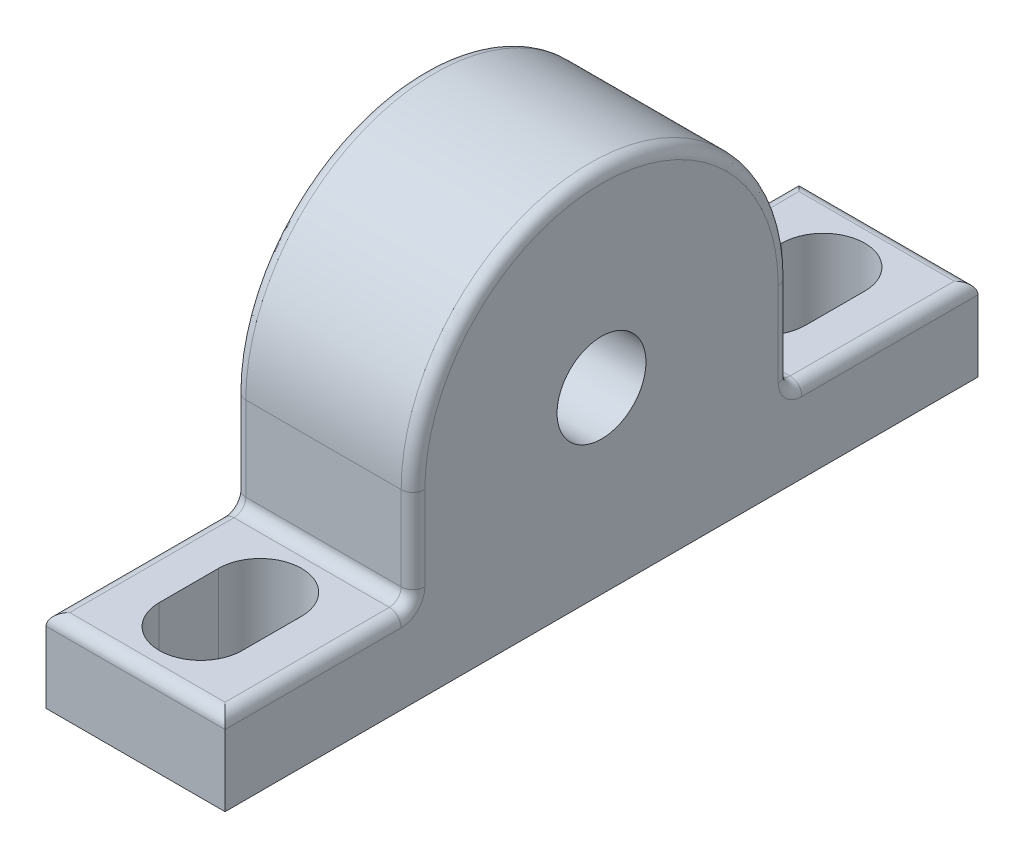
ISO-10303-21;
HEADER;
FILE_DESCRIPTION(('STEP AP214'),'2;1');
FILE_NAME('part.step','',(''),(''),'','','');
FILE_SCHEMA(('AUTOMOTIVE_DESIGN { 1 0 10303 214 1 1 1 1 }'));
ENDSEC;
DATA;
#1=APPLICATION_CONTEXT('core data for automotive mechanical design processes');
#2=APPLICATION_PROTOCOL_DEFINITION('international standard','automotive_design',2000,#1);
#3=PRODUCT_CONTEXT('',#1,'mechanical');
#4=PRODUCT('Part','Part','',(#3));
#5=PRODUCT_RELATED_PRODUCT_CATEGORY('part','',(#4));
#6=PRODUCT_DEFINITION_FORMATION('','',#4);
#7=PRODUCT_DEFINITION_CONTEXT('part definition',#1,'design');
#8=PRODUCT_DEFINITION('design','',#6,#7);
#9=PRODUCT_DEFINITION_SHAPE('','',#8);
#10=(LENGTH_UNIT() NAMED_UNIT(*) SI_UNIT(.MILLI.,.METRE.));
#11=(NAMED_UNIT(*) PLANE_ANGLE_UNIT() SI_UNIT($,.RADIAN.));
#12=(NAMED_UNIT(*) SI_UNIT($,.STERADIAN.) SOLID_ANGLE_UNIT());
#13=UNCERTAINTY_MEASURE_WITH_UNIT(LENGTH_MEASURE(1.E-05),#10,'distance_accuracy_value','');
#14=(GEOMETRIC_REPRESENTATION_CONTEXT(3) GLOBAL_UNCERTAINTY_ASSIGNED_CONTEXT((#13)) GLOBAL_UNIT_ASSIGNED_CONTEXT((#10,
#11,#12)) REPRESENTATION_CONTEXT('',''));
#15=CARTESIAN_POINT('',(0.,0.,0.));
#16=DIRECTION('',(0.,0.,1.));
#17=DIRECTION('',(1.,0.,0.));
#18=AXIS2_PLACEMENT_3D('',#15,#16,#17);
#19=CARTESIAN_POINT('',(30.2,0.,63.5));
#20=DIRECTION('',(0.,0.,-1.));
#21=DIRECTION('',(-1.,0.,0.));
#22=AXIS2_PLACEMENT_3D('',#19,#20,#21);
#23=PLANE('',#22);
#24=DIRECTION('',(0.,-1.,0.));
#25=VECTOR('',#24,1.);
#26=CARTESIAN_POINT('',(30.2,0.,63.5));
#27=LINE('',#26,#25);
#28=CARTESIAN_POINT('',(30.2,12.,63.5));
#29=VERTEX_POINT('',#28);
#30=CARTESIAN_POINT('',(30.2,0.,63.5));
#31=VERTEX_POINT('',#30);
#32=EDGE_CURVE('E292',#29,#31,#27,.T.);
#33=ORIENTED_EDGE('',*,*,#32,.F.);
#34=DIRECTION('',(-1.,0.,0.));
#35=VECTOR('',#34,1.);
#36=CARTESIAN_POINT('',(30.2,12.,63.5));
#37=LINE('',#36,#35);
#38=CARTESIAN_POINT('',(0.,12.,63.5));
#39=VERTEX_POINT('',#38);
#40=EDGE_CURVE('E49',#29,#39,#37,.T.);
#41=ORIENTED_EDGE('',*,*,#40,.T.);
#42=DIRECTION('',(0.,-1.,0.));
#43=VECTOR('',#42,1.);
#44=CARTESIAN_POINT('',(0.,0.,63.5));
#45=LINE('',#44,#43);
#46=CARTESIAN_POINT('',(0.,0.,63.5));
#47=VERTEX_POINT('',#46);
#48=EDGE_CURVE('E288',#39,#47,#45,.T.);
#49=ORIENTED_EDGE('',*,*,#48,.T.);
#50=DIRECTION('',(-1.,0.,0.));
#51=VECTOR('',#50,1.);
#52=CARTESIAN_POINT('',(30.2,0.,63.5));
#53=LINE('',#52,#51);
#54=EDGE_CURVE('E314',#31,#47,#53,.T.);
#55=ORIENTED_EDGE('',*,*,#54,.F.);
#56=EDGE_LOOP('',(#33,#41,#49,#55));
#57=FACE_BOUND('',#56,.T.);
#58=ADVANCED_FACE('F40',(#57),#23,.F.);
#59=CARTESIAN_POINT('',(30.2,0.,63.5));
#60=DIRECTION('',(0.,1.,0.));
#61=DIRECTION('',(0.,0.,1.));
#62=AXIS2_PLACEMENT_3D('',#59,#60,#61);
#63=PLANE('',#62);
#64=DIRECTION('',(0.,0.,-1.));
#65=VECTOR('',#64,1.);
#66=CARTESIAN_POINT('',(8.1,0.,52.5));
#67=LINE('',#66,#65);
#68=CARTESIAN_POINT('',(8.1,0.,52.5));
#69=VERTEX_POINT('',#68);
#70=CARTESIAN_POINT('',(8.1,0.,42.5));
#71=VERTEX_POINT('',#70);
#72=EDGE_CURVE('E238',#69,#71,#67,.T.);
#73=ORIENTED_EDGE('',*,*,#72,.F.);
#74=CARTESIAN_POINT('',(15.1,0.,52.5));
#75=DIRECTION('',(0.,1.,0.));
#76=DIRECTION('',(0.,0.,1.));
#77=AXIS2_PLACEMENT_3D('',#74,#75,#76);
#78=CIRCLE('',#77,7.);
#79=CARTESIAN_POINT('',(22.1,0.,52.5));
#80=VERTEX_POINT('',#79);
#81=EDGE_CURVE('E218',#80,#69,#78,.F.);
#82=ORIENTED_EDGE('',*,*,#81,.F.);
#83=DIRECTION('',(0.,0.,1.));
#84=VECTOR('',#83,1.);
#85=CARTESIAN_POINT('',(22.1,0.,52.5));
#86=LINE('',#85,#84);
#87=CARTESIAN_POINT('',(22.1,0.,42.5));
#88=VERTEX_POINT('',#87);
#89=EDGE_CURVE('E229',#88,#80,#86,.T.);
#90=ORIENTED_EDGE('',*,*,#89,.F.);
#91=CARTESIAN_POINT('',(15.1,0.,42.5));
#92=DIRECTION('',(0.,1.,0.));
#93=DIRECTION('',(0.,0.,1.));
#94=AXIS2_PLACEMENT_3D('',#91,#92,#93);
#95=CIRCLE('',#94,7.);
#96=EDGE_CURVE('E57',#71,#88,#95,.F.);
#97=ORIENTED_EDGE('',*,*,#96,.F.);
#98=EDGE_LOOP('',(#73,#82,#90,#97));
#99=FACE_BOUND('',#98,.T.);
#100=DIRECTION('',(0.,0.,-1.));
#101=VECTOR('',#100,1.);
#102=CARTESIAN_POINT('',(8.1,0.,-42.5));
#103=LINE('',#102,#101);
#104=CARTESIAN_POINT('',(8.1,0.,-42.5));
#105=VERTEX_POINT('',#104);
#106=CARTESIAN_POINT('',(8.1,0.,-52.5));
#107=VERTEX_POINT('',#106);
#108=EDGE_CURVE('E256',#105,#107,#103,.T.);
#109=ORIENTED_EDGE('',*,*,#108,.F.);
#110=CARTESIAN_POINT('',(15.1,0.,-42.5));
#111=DIRECTION('',(0.,1.,0.));
#112=DIRECTION('',(0.,0.,1.));
#113=AXIS2_PLACEMENT_3D('',#110,#111,#112);
#114=CIRCLE('',#113,7.);
#115=CARTESIAN_POINT('',(22.1,0.,-42.5));
#116=VERTEX_POINT('',#115);
#117=EDGE_CURVE('E259',#116,#105,#114,.F.);
#118=ORIENTED_EDGE('',*,*,#117,.F.);
#119=DIRECTION('',(0.,0.,1.));
#120=VECTOR('',#119,1.);
#121=CARTESIAN_POINT('',(22.1,0.,-42.5));
#122=LINE('',#121,#120);
#123=CARTESIAN_POINT('',(22.1,0.,-52.5));
#124=VERTEX_POINT('',#123);
#125=EDGE_CURVE('E276',#124,#116,#122,.T.);
#126=ORIENTED_EDGE('',*,*,#125,.F.);
#127=CARTESIAN_POINT('',(15.1,0.,-52.5));
#128=DIRECTION('',(0.,1.,0.));
#129=DIRECTION('',(0.,0.,1.));
#130=AXIS2_PLACEMENT_3D('',#127,#128,#129);
#131=CIRCLE('',#130,7.);
#132=EDGE_CURVE('E65',#107,#124,#131,.F.);
#133=ORIENTED_EDGE('',*,*,#132,.F.);
#134=EDGE_LOOP('',(#109,#118,#126,#133));
#135=FACE_BOUND('',#134,.T.);
#136=DIRECTION('',(0.,0.,-1.));
#137=VECTOR('',#136,1.);
#138=CARTESIAN_POINT('',(0.,0.,63.5));
#139=LINE('',#138,#137);
#140=CARTESIAN_POINT('',(0.,0.,-63.5));
#141=VERTEX_POINT('',#140);
#142=EDGE_CURVE('E302',#47,#141,#139,.T.);
#143=ORIENTED_EDGE('',*,*,#142,.T.);
#144=DIRECTION('',(-1.,0.,0.));
#145=VECTOR('',#144,1.);
#146=CARTESIAN_POINT('',(30.2,0.,-63.5));
#147=LINE('',#146,#145);
#148=CARTESIAN_POINT('',(30.2,0.,-63.5));
#149=VERTEX_POINT('',#148);
#150=EDGE_CURVE('E311',#149,#141,#147,.T.);
#151=ORIENTED_EDGE('',*,*,#150,.F.);
#152=DIRECTION('',(0.,0.,-1.));
#153=VECTOR('',#152,1.);
#154=CARTESIAN_POINT('',(30.2,0.,63.5));
#155=LINE('',#154,#153);
#156=EDGE_CURVE('E294',#31,#149,#155,.T.);
#157=ORIENTED_EDGE('',*,*,#156,.F.);
#158=ORIENTED_EDGE('',*,*,#54,.T.);
#159=EDGE_LOOP('',(#143,#151,#157,#158));
#160=FACE_BOUND('',#159,.T.);
#161=ADVANCED_FACE('F235',(#99,#135,#160),#63,.F.);
#162=CARTESIAN_POINT('',(30.2,0.,-63.5));
#163=DIRECTION('',(0.,0.,1.));
#164=DIRECTION('',(1.,0.,0.));
#165=AXIS2_PLACEMENT_3D('',#162,#163,#164);
#166=PLANE('',#165);
#167=DIRECTION('',(0.,1.,0.));
#168=VECTOR('',#167,1.);
#169=CARTESIAN_POINT('',(0.,0.,-63.5));
#170=LINE('',#169,#168);
#171=CARTESIAN_POINT('',(0.,12.,-63.5));
#172=VERTEX_POINT('',#171);
#173=EDGE_CURVE('E295',#141,#172,#170,.T.);
#174=ORIENTED_EDGE('',*,*,#173,.T.);
#175=DIRECTION('',(-1.,0.,0.));
#176=VECTOR('',#175,1.);
#177=CARTESIAN_POINT('',(30.2,12.,-63.5));
#178=LINE('',#177,#176);
#179=CARTESIAN_POINT('',(30.2,12.,-63.5));
#180=VERTEX_POINT('',#179);
#181=EDGE_CURVE('E11',#172,#180,#178,.F.);
#182=ORIENTED_EDGE('',*,*,#181,.T.);
#183=DIRECTION('',(0.,1.,0.));
#184=VECTOR('',#183,1.);
#185=CARTESIAN_POINT('',(30.2,0.,-63.5));
#186=LINE('',#185,#184);
#187=EDGE_CURVE('E297',#149,#180,#186,.T.);
#188=ORIENTED_EDGE('',*,*,#187,.F.);
#189=ORIENTED_EDGE('',*,*,#150,.T.);
#190=EDGE_LOOP('',(#174,#182,#188,#189));
#191=FACE_BOUND('',#190,.T.);
#192=ADVANCED_FACE('F466',(#191),#166,.F.);
#193=CARTESIAN_POINT('',(30.2,14.,-31.8));
#194=DIRECTION('',(0.,-1.,0.));
#195=DIRECTION('',(0.,0.,-1.));
#196=AXIS2_PLACEMENT_3D('',#193,#194,#195);
#197=PLANE('',#196);
#198=DIRECTION('',(0.,0.,-1.));
#199=VECTOR('',#198,1.);
#200=CARTESIAN_POINT('',(22.1,14.,-42.5));
#201=LINE('',#200,#199);
#202=CARTESIAN_POINT('',(22.1,14.,-42.5));
#203=VERTEX_POINT('',#202);
#204=CARTESIAN_POINT('',(22.1,14.,-52.5));
#205=VERTEX_POINT('',#204);
#206=EDGE_CURVE('E264',#203,#205,#201,.T.);
#207=ORIENTED_EDGE('',*,*,#206,.F.);
#208=CARTESIAN_POINT('',(15.1,14.,-42.5));
#209=DIRECTION('',(0.,1.,0.));
#210=DIRECTION('',(0.,0.,1.));
#211=AXIS2_PLACEMENT_3D('',#208,#209,#210);
#212=CIRCLE('',#211,7.);
#213=CARTESIAN_POINT('',(8.1,14.,-42.5));
#214=VERTEX_POINT('',#213);
#215=EDGE_CURVE('E262',#214,#203,#212,.T.);
#216=ORIENTED_EDGE('',*,*,#215,.F.);
#217=DIRECTION('',(0.,0.,1.));
#218=VECTOR('',#217,1.);
#219=CARTESIAN_POINT('',(8.1,14.,-42.5));
#220=LINE('',#219,#218);
#221=CARTESIAN_POINT('',(8.1,14.,-52.5));
#222=VERTEX_POINT('',#221);
#223=EDGE_CURVE('E270',#222,#214,#220,.T.);
#224=ORIENTED_EDGE('',*,*,#223,.F.);
#225=CARTESIAN_POINT('',(15.1,14.,-52.5));
#226=DIRECTION('',(0.,1.,0.));
#227=DIRECTION('',(0.,0.,1.));
#228=AXIS2_PLACEMENT_3D('',#225,#226,#227);
#229=CIRCLE('',#228,7.);
#230=EDGE_CURVE('E267',#205,#222,#229,.T.);
#231=ORIENTED_EDGE('',*,*,#230,.F.);
#232=EDGE_LOOP('',(#207,#216,#224,#231));
#233=FACE_BOUND('',#232,.T.);
#234=DIRECTION('',(0.,0.,1.));
#235=VECTOR('',#234,1.);
#236=CARTESIAN_POINT('',(28.2,14.,-63.5));
#237=LINE('',#236,#235);
#238=CARTESIAN_POINT('',(28.2,14.,-33.8));
#239=VERTEX_POINT('',#238);
#240=CARTESIAN_POINT('',(28.2,14.,-61.5));
#241=VERTEX_POINT('',#240);
#242=EDGE_CURVE('E338',#239,#241,#237,.F.);
#243=ORIENTED_EDGE('',*,*,#242,.T.);
#244=DIRECTION('',(-1.,0.,0.));
#245=VECTOR('',#244,1.);
#246=CARTESIAN_POINT('',(30.2,14.,-61.5));
#247=LINE('',#246,#245);
#248=CARTESIAN_POINT('',(2.,14.,-61.5));
#249=VERTEX_POINT('',#248);
#250=EDGE_CURVE('E341',#241,#249,#247,.T.);
#251=ORIENTED_EDGE('',*,*,#250,.T.);
#252=DIRECTION('',(0.,0.,1.));
#253=VECTOR('',#252,1.);
#254=CARTESIAN_POINT('',(2.,14.,-31.8));
#255=LINE('',#254,#253);
#256=CARTESIAN_POINT('',(2.,14.,-33.8));
#257=VERTEX_POINT('',#256);
#258=EDGE_CURVE('E336',#249,#257,#255,.T.);
#259=ORIENTED_EDGE('',*,*,#258,.T.);
#260=DIRECTION('',(-1.,0.,0.));
#261=VECTOR('',#260,1.);
#262=CARTESIAN_POINT('',(30.2,14.,-33.8));
#263=LINE('',#262,#261);
#264=EDGE_CURVE('E334',#257,#239,#263,.F.);
#265=ORIENTED_EDGE('',*,*,#264,.T.);
#266=EDGE_LOOP('',(#243,#251,#259,#265));
#267=FACE_BOUND('',#266,.T.);
#268=ADVANCED_FACE('F535',(#233,#267),#197,.F.);
#269=CARTESIAN_POINT('',(30.2,30.2,-31.8));
#270=DIRECTION('',(0.,0.,1.));
#271=DIRECTION('',(1.,0.,0.));
#272=AXIS2_PLACEMENT_3D('',#269,#270,#271);
#273=PLANE('',#272);
#274=DIRECTION('',(-1.,0.,0.));
#275=VECTOR('',#274,1.);
#276=CARTESIAN_POINT('',(30.2,30.2,-31.8));
#277=LINE('',#276,#275);
#278=CARTESIAN_POINT('',(28.2,30.2,-31.8));
#279=VERTEX_POINT('',#278);
#280=CARTESIAN_POINT('',(2.,30.2,-31.8));
#281=VERTEX_POINT('',#280);
#282=EDGE_CURVE('E308',#279,#281,#277,.T.);
#283=ORIENTED_EDGE('',*,*,#282,.F.);
#284=DIRECTION('',(0.,1.,0.));
#285=VECTOR('',#284,1.);
#286=CARTESIAN_POINT('',(28.2,14.,-31.8));
#287=LINE('',#286,#285);
#288=CARTESIAN_POINT('',(28.2,16.,-31.8));
#289=VERTEX_POINT('',#288);
#290=EDGE_CURVE('E363',#279,#289,#287,.F.);
#291=ORIENTED_EDGE('',*,*,#290,.T.);
#292=DIRECTION('',(-1.,0.,0.));
#293=VECTOR('',#292,1.);
#294=CARTESIAN_POINT('',(0.,16.,-31.8));
#295=LINE('',#294,#293);
#296=CARTESIAN_POINT('',(2.,16.,-31.8));
#297=VERTEX_POINT('',#296);
#298=EDGE_CURVE('E359',#289,#297,#295,.T.);
#299=ORIENTED_EDGE('',*,*,#298,.T.);
#300=DIRECTION('',(0.,1.,0.));
#301=VECTOR('',#300,1.);
#302=CARTESIAN_POINT('',(2.,30.2,-31.8));
#303=LINE('',#302,#301);
#304=EDGE_CURVE('E361',#297,#281,#303,.T.);
#305=ORIENTED_EDGE('',*,*,#304,.T.);
#306=EDGE_LOOP('',(#283,#291,#299,#305));
#307=FACE_BOUND('',#306,.T.);
#308=ADVANCED_FACE('F542',(#307),#273,.F.);
#309=CARTESIAN_POINT('',(30.2,30.2,0.));
#310=DIRECTION('',(-1.,0.,0.));
#311=DIRECTION('',(0.,0.,1.));
#312=AXIS2_PLACEMENT_3D('',#309,#310,#311);
#313=CYLINDRICAL_SURFACE('',#312,31.8);
#314=DIRECTION('',(-1.,0.,0.));
#315=VECTOR('',#314,1.);
#316=CARTESIAN_POINT('',(30.2,30.1999999999998,31.8));
#317=LINE('',#316,#315);
#318=CARTESIAN_POINT('',(28.2,30.1999999999998,31.8));
#319=VERTEX_POINT('',#318);
#320=CARTESIAN_POINT('',(2.,30.1999999999998,31.8));
#321=VERTEX_POINT('',#320);
#322=EDGE_CURVE('E300',#319,#321,#317,.T.);
#323=ORIENTED_EDGE('',*,*,#322,.F.);
#324=CARTESIAN_POINT('',(28.2,30.2,0.));
#325=DIRECTION('',(1.,0.,0.));
#326=DIRECTION('',(0.,0.,-1.));
#327=AXIS2_PLACEMENT_3D('',#324,#325,#326);
#328=CIRCLE('',#327,31.8);
#329=EDGE_CURVE('E368',#319,#279,#328,.F.);
#330=ORIENTED_EDGE('',*,*,#329,.T.);
#331=ORIENTED_EDGE('',*,*,#282,.T.);
#332=CARTESIAN_POINT('',(2.,30.2,0.));
#333=DIRECTION('',(1.,0.,0.));
#334=DIRECTION('',(0.,0.,-1.));
#335=AXIS2_PLACEMENT_3D('',#332,#333,#334);
#336=CIRCLE('',#335,31.8);
#337=EDGE_CURVE('E366',#281,#321,#336,.T.);
#338=ORIENTED_EDGE('',*,*,#337,.T.);
#339=EDGE_LOOP('',(#323,#330,#331,#338));
#340=FACE_BOUND('',#339,.T.);
#341=ADVANCED_FACE('F545',(#340),#313,.T.);
#342=CARTESIAN_POINT('',(30.2,30.1999999999998,31.8));
#343=DIRECTION('',(0.,0.,-1.));
#344=DIRECTION('',(-1.,0.,0.));
#345=AXIS2_PLACEMENT_3D('',#342,#343,#344);
#346=PLANE('',#345);
#347=DIRECTION('',(-1.,0.,0.));
#348=VECTOR('',#347,1.);
#349=CARTESIAN_POINT('',(30.2,16.,31.8));
#350=LINE('',#349,#348);
#351=CARTESIAN_POINT('',(2.,16.,31.8));
#352=VERTEX_POINT('',#351);
#353=CARTESIAN_POINT('',(28.2,16.,31.8));
#354=VERTEX_POINT('',#353);
#355=EDGE_CURVE('E370',#352,#354,#350,.F.);
#356=ORIENTED_EDGE('',*,*,#355,.T.);
#357=DIRECTION('',(0.,-1.,0.));
#358=VECTOR('',#357,1.);
#359=CARTESIAN_POINT('',(28.2,30.1999999999998,31.8));
#360=LINE('',#359,#358);
#361=EDGE_CURVE('E374',#354,#319,#360,.F.);
#362=ORIENTED_EDGE('',*,*,#361,.T.);
#363=ORIENTED_EDGE('',*,*,#322,.T.);
#364=DIRECTION('',(0.,-1.,0.));
#365=VECTOR('',#364,1.);
#366=CARTESIAN_POINT('',(2.,30.1999999999998,31.8));
#367=LINE('',#366,#365);
#368=EDGE_CURVE('E372',#321,#352,#367,.T.);
#369=ORIENTED_EDGE('',*,*,#368,.T.);
#370=EDGE_LOOP('',(#356,#362,#363,#369));
#371=FACE_BOUND('',#370,.T.);
#372=ADVANCED_FACE('F547',(#371),#346,.F.);
#373=CARTESIAN_POINT('',(30.2,14.,63.5));
#374=DIRECTION('',(0.,-1.,0.));
#375=DIRECTION('',(0.,0.,-1.));
#376=AXIS2_PLACEMENT_3D('',#373,#374,#375);
#377=PLANE('',#376);
#378=DIRECTION('',(0.,0.,-1.));
#379=VECTOR('',#378,1.);
#380=CARTESIAN_POINT('',(22.1,14.,52.5));
#381=LINE('',#380,#379);
#382=CARTESIAN_POINT('',(22.1,14.,52.5));
#383=VERTEX_POINT('',#382);
#384=CARTESIAN_POINT('',(22.1,14.,42.5));
#385=VERTEX_POINT('',#384);
#386=EDGE_CURVE('E240',#383,#385,#381,.T.);
#387=ORIENTED_EDGE('',*,*,#386,.F.);
#388=CARTESIAN_POINT('',(15.1,14.,52.5));
#389=DIRECTION('',(0.,1.,0.));
#390=DIRECTION('',(0.,0.,1.));
#391=AXIS2_PLACEMENT_3D('',#388,#389,#390);
#392=CIRCLE('',#391,7.);
#393=CARTESIAN_POINT('',(8.1,14.,52.5));
#394=VERTEX_POINT('',#393);
#395=EDGE_CURVE('E221',#394,#383,#392,.T.);
#396=ORIENTED_EDGE('',*,*,#395,.F.);
#397=DIRECTION('',(0.,0.,1.));
#398=VECTOR('',#397,1.);
#399=CARTESIAN_POINT('',(8.1,14.,52.5));
#400=LINE('',#399,#398);
#401=CARTESIAN_POINT('',(8.1,14.,42.5));
#402=VERTEX_POINT('',#401);
#403=EDGE_CURVE('E226',#402,#394,#400,.T.);
#404=ORIENTED_EDGE('',*,*,#403,.F.);
#405=CARTESIAN_POINT('',(15.1,14.,42.5));
#406=DIRECTION('',(0.,1.,0.));
#407=DIRECTION('',(0.,0.,1.));
#408=AXIS2_PLACEMENT_3D('',#405,#406,#407);
#409=CIRCLE('',#408,7.);
#410=EDGE_CURVE('E246',#385,#402,#409,.T.);
#411=ORIENTED_EDGE('',*,*,#410,.F.);
#412=EDGE_LOOP('',(#387,#396,#404,#411));
#413=FACE_BOUND('',#412,.T.);
#414=DIRECTION('',(0.,0.,1.));
#415=VECTOR('',#414,1.);
#416=CARTESIAN_POINT('',(28.2,14.,31.8));
#417=LINE('',#416,#415);
#418=CARTESIAN_POINT('',(28.2,14.,61.5));
#419=VERTEX_POINT('',#418);
#420=CARTESIAN_POINT('',(28.2,14.,33.8));
#421=VERTEX_POINT('',#420);
#422=EDGE_CURVE('E380',#419,#421,#417,.F.);
#423=ORIENTED_EDGE('',*,*,#422,.T.);
#424=DIRECTION('',(-1.,0.,0.));
#425=VECTOR('',#424,1.);
#426=CARTESIAN_POINT('',(0.,14.,33.8));
#427=LINE('',#426,#425);
#428=CARTESIAN_POINT('',(2.,14.,33.8));
#429=VERTEX_POINT('',#428);
#430=EDGE_CURVE('E382',#421,#429,#427,.T.);
#431=ORIENTED_EDGE('',*,*,#430,.T.);
#432=DIRECTION('',(0.,0.,1.));
#433=VECTOR('',#432,1.);
#434=CARTESIAN_POINT('',(2.,14.,63.5));
#435=LINE('',#434,#433);
#436=CARTESIAN_POINT('',(2.,14.,61.5));
#437=VERTEX_POINT('',#436);
#438=EDGE_CURVE('E376',#429,#437,#435,.T.);
#439=ORIENTED_EDGE('',*,*,#438,.T.);
#440=DIRECTION('',(-1.,0.,0.));
#441=VECTOR('',#440,1.);
#442=CARTESIAN_POINT('',(30.2,14.,61.5));
#443=LINE('',#442,#441);
#444=EDGE_CURVE('E378',#437,#419,#443,.F.);
#445=ORIENTED_EDGE('',*,*,#444,.T.);
#446=EDGE_LOOP('',(#423,#431,#439,#445));
#447=FACE_BOUND('',#446,.T.);
#448=ADVANCED_FACE('F505',(#413,#447),#377,.F.);
#449=CARTESIAN_POINT('',(30.2,30.2,0.));
#450=DIRECTION('',(1.,0.,0.));
#451=DIRECTION('',(0.,0.,-1.));
#452=AXIS2_PLACEMENT_3D('',#449,#450,#451);
#453=PLANE('',#452);
#454=CARTESIAN_POINT('',(30.2,30.2,0.));
#455=DIRECTION('',(1.,0.,0.));
#456=DIRECTION('',(0.,0.,-1.));
#457=AXIS2_PLACEMENT_3D('',#454,#455,#456);
#458=CIRCLE('',#457,7.5);
#459=CARTESIAN_POINT('',(30.2,30.2,-7.5));
#460=VERTEX_POINT('',#459);
#461=EDGE_CURVE('E289',#460,#460,#458,.T.);
#462=ORIENTED_EDGE('',*,*,#461,.F.);
#463=EDGE_LOOP('',(#462));
#464=FACE_BOUND('',#463,.T.);
#465=ORIENTED_EDGE('',*,*,#187,.T.);
#466=DIRECTION('',(0.,0.,1.));
#467=VECTOR('',#466,1.);
#468=CARTESIAN_POINT('',(30.2,12.,-31.8));
#469=LINE('',#468,#467);
#470=CARTESIAN_POINT('',(30.2,12.,-33.8));
#471=VERTEX_POINT('',#470);
#472=EDGE_CURVE('E331',#180,#471,#469,.T.);
#473=ORIENTED_EDGE('',*,*,#472,.T.);
#474=CARTESIAN_POINT('',(30.2,16.,-33.8));
#475=DIRECTION('',(1.,0.,0.));
#476=DIRECTION('',(0.,0.,-1.));
#477=AXIS2_PLACEMENT_3D('',#474,#475,#476);
#478=CIRCLE('',#477,4.);
#479=CARTESIAN_POINT('',(30.2,16.,-29.8));
#480=VERTEX_POINT('',#479);
#481=EDGE_CURVE('E328',#480,#471,#478,.T.);
#482=ORIENTED_EDGE('',*,*,#481,.F.);
#483=DIRECTION('',(0.,1.,0.));
#484=VECTOR('',#483,1.);
#485=CARTESIAN_POINT('',(30.2,30.2,-29.8));
#486=LINE('',#485,#484);
#487=CARTESIAN_POINT('',(30.2,30.2,-29.8));
#488=VERTEX_POINT('',#487);
#489=EDGE_CURVE('E326',#480,#488,#486,.T.);
#490=ORIENTED_EDGE('',*,*,#489,.T.);
#491=CARTESIAN_POINT('',(30.2,30.2,0.));
#492=DIRECTION('',(1.,0.,0.));
#493=DIRECTION('',(0.,0.,-1.));
#494=AXIS2_PLACEMENT_3D('',#491,#492,#493);
#495=CIRCLE('',#494,29.8);
#496=CARTESIAN_POINT('',(30.2,30.1999999999998,29.8));
#497=VERTEX_POINT('',#496);
#498=EDGE_CURVE('E324',#488,#497,#495,.T.);
#499=ORIENTED_EDGE('',*,*,#498,.T.);
#500=DIRECTION('',(0.,-1.,0.));
#501=VECTOR('',#500,1.);
#502=CARTESIAN_POINT('',(30.2,14.,29.8));
#503=LINE('',#502,#501);
#504=CARTESIAN_POINT('',(30.2,16.,29.8));
#505=VERTEX_POINT('',#504);
#506=EDGE_CURVE('E322',#497,#505,#503,.T.);
#507=ORIENTED_EDGE('',*,*,#506,.T.);
#508=CARTESIAN_POINT('',(30.2,16.,33.8));
#509=DIRECTION('',(1.,0.,0.));
#510=DIRECTION('',(0.,0.,-1.));
#511=AXIS2_PLACEMENT_3D('',#508,#509,#510);
#512=CIRCLE('',#511,4.);
#513=CARTESIAN_POINT('',(30.2,12.,33.8));
#514=VERTEX_POINT('',#513);
#515=EDGE_CURVE('E319',#514,#505,#512,.T.);
#516=ORIENTED_EDGE('',*,*,#515,.F.);
#517=DIRECTION('',(0.,0.,1.));
#518=VECTOR('',#517,1.);
#519=CARTESIAN_POINT('',(30.2,12.,63.5));
#520=LINE('',#519,#518);
#521=EDGE_CURVE('E317',#514,#29,#520,.T.);
#522=ORIENTED_EDGE('',*,*,#521,.T.);
#523=ORIENTED_EDGE('',*,*,#32,.T.);
#524=ORIENTED_EDGE('',*,*,#156,.T.);
#525=EDGE_LOOP('',(#465,#473,#482,#490,#499,#507,#516,#522,#523,#524));
#526=FACE_BOUND('',#525,.T.);
#527=ADVANCED_FACE('F460',(#464,#526),#453,.T.);
#528=CARTESIAN_POINT('',(0.,30.2,0.));
#529=DIRECTION('',(1.,0.,0.));
#530=DIRECTION('',(0.,0.,-1.));
#531=AXIS2_PLACEMENT_3D('',#528,#529,#530);
#532=PLANE('',#531);
#533=CARTESIAN_POINT('',(0.,30.2,0.));
#534=DIRECTION('',(1.,0.,0.));
#535=DIRECTION('',(0.,0.,-1.));
#536=AXIS2_PLACEMENT_3D('',#533,#534,#535);
#537=CIRCLE('',#536,7.5);
#538=CARTESIAN_POINT('',(0.,30.2,-7.5));
#539=VERTEX_POINT('',#538);
#540=EDGE_CURVE('E285',#539,#539,#537,.T.);
#541=ORIENTED_EDGE('',*,*,#540,.T.);
#542=EDGE_LOOP('',(#541));
#543=FACE_BOUND('',#542,.T.);
#544=CARTESIAN_POINT('',(0.,16.,-33.8));
#545=DIRECTION('',(1.,0.,0.));
#546=DIRECTION('',(0.,0.,-1.));
#547=AXIS2_PLACEMENT_3D('',#544,#545,#546);
#548=CIRCLE('',#547,4.);
#549=CARTESIAN_POINT('',(0.,12.,-33.8));
#550=VERTEX_POINT('',#549);
#551=CARTESIAN_POINT('',(0.,16.,-29.8));
#552=VERTEX_POINT('',#551);
#553=EDGE_CURVE('E354',#550,#552,#548,.F.);
#554=ORIENTED_EDGE('',*,*,#553,.F.);
#555=DIRECTION('',(0.,0.,1.));
#556=VECTOR('',#555,1.);
#557=CARTESIAN_POINT('',(0.,12.,0.));
#558=LINE('',#557,#556);
#559=EDGE_CURVE('E357',#550,#172,#558,.F.);
#560=ORIENTED_EDGE('',*,*,#559,.T.);
#561=ORIENTED_EDGE('',*,*,#173,.F.);
#562=ORIENTED_EDGE('',*,*,#142,.F.);
#563=ORIENTED_EDGE('',*,*,#48,.F.);
#564=DIRECTION('',(0.,0.,1.));
#565=VECTOR('',#564,1.);
#566=CARTESIAN_POINT('',(0.,12.,0.));
#567=LINE('',#566,#565);
#568=CARTESIAN_POINT('',(0.,12.,33.8));
#569=VERTEX_POINT('',#568);
#570=EDGE_CURVE('E346',#39,#569,#567,.F.);
#571=ORIENTED_EDGE('',*,*,#570,.T.);
#572=CARTESIAN_POINT('',(0.,16.,33.8));
#573=DIRECTION('',(1.,0.,0.));
#574=DIRECTION('',(0.,0.,-1.));
#575=AXIS2_PLACEMENT_3D('',#572,#573,#574);
#576=CIRCLE('',#575,4.);
#577=CARTESIAN_POINT('',(0.,16.,29.8));
#578=VERTEX_POINT('',#577);
#579=EDGE_CURVE('E343',#578,#569,#576,.F.);
#580=ORIENTED_EDGE('',*,*,#579,.F.);
#581=DIRECTION('',(0.,-1.,0.));
#582=VECTOR('',#581,1.);
#583=CARTESIAN_POINT('',(0.,30.2,29.8));
#584=LINE('',#583,#582);
#585=CARTESIAN_POINT('',(0.,30.1999999999998,29.8));
#586=VERTEX_POINT('',#585);
#587=EDGE_CURVE('E348',#578,#586,#584,.F.);
#588=ORIENTED_EDGE('',*,*,#587,.T.);
#589=CARTESIAN_POINT('',(0.,30.2,0.));
#590=DIRECTION('',(1.,0.,0.));
#591=DIRECTION('',(0.,0.,-1.));
#592=AXIS2_PLACEMENT_3D('',#589,#590,#591);
#593=CIRCLE('',#592,29.8);
#594=CARTESIAN_POINT('',(0.,30.2,-29.8));
#595=VERTEX_POINT('',#594);
#596=EDGE_CURVE('E350',#586,#595,#593,.F.);
#597=ORIENTED_EDGE('',*,*,#596,.T.);
#598=DIRECTION('',(0.,1.,0.));
#599=VECTOR('',#598,1.);
#600=CARTESIAN_POINT('',(0.,30.2,-29.8));
#601=LINE('',#600,#599);
#602=EDGE_CURVE('E352',#595,#552,#601,.F.);
#603=ORIENTED_EDGE('',*,*,#602,.T.);
#604=EDGE_LOOP('',(#554,#560,#561,#562,#563,#571,#580,#588,#597,#603));
#605=FACE_BOUND('',#604,.T.);
#606=ADVANCED_FACE('F451',(#543,#605),#532,.F.);
#607=CARTESIAN_POINT('',(0.,30.2,0.));
#608=DIRECTION('',(1.,0.,0.));
#609=DIRECTION('',(0.,0.,-1.));
#610=AXIS2_PLACEMENT_3D('',#607,#608,#609);
#611=CYLINDRICAL_SURFACE('',#610,7.5);
#612=ORIENTED_EDGE('',*,*,#540,.F.);
#613=EDGE_LOOP('',(#612));
#614=FACE_BOUND('',#613,.T.);
#615=ORIENTED_EDGE('',*,*,#461,.T.);
#616=EDGE_LOOP('',(#615));
#617=FACE_BOUND('',#616,.T.);
#618=ADVANCED_FACE('F600',(#614,#617),#611,.F.);
#619=CARTESIAN_POINT('',(2.,12.,63.5));
#620=DIRECTION('',(0.,0.,1.));
#621=DIRECTION('',(0.,-1.,0.));
#622=AXIS2_PLACEMENT_3D('',#619,#620,#621);
#623=CYLINDRICAL_SURFACE('',#622,2.);
#624=CARTESIAN_POINT('',(2.,12.,33.8));
#625=DIRECTION('',(0.,0.,-1.));
#626=DIRECTION('',(-1.,0.,0.));
#627=AXIS2_PLACEMENT_3D('',#624,#625,#626);
#628=CIRCLE('',#627,2.);
#629=EDGE_CURVE('E434',#569,#429,#628,.T.);
#630=ORIENTED_EDGE('',*,*,#629,.F.);
#631=ORIENTED_EDGE('',*,*,#570,.F.);
#632=CARTESIAN_POINT('',(2.,12.,61.5));
#633=DIRECTION('',(0.707106781186547,0.,0.707106781186547));
#634=DIRECTION('',(-0.707106781186547,0.,0.707106781186547));
#635=AXIS2_PLACEMENT_3D('',#632,#633,#634);
#636=ELLIPSE('',#635,2.82842712474619,2.);
#637=EDGE_CURVE('E44',#437,#39,#636,.T.);
#638=ORIENTED_EDGE('',*,*,#637,.F.);
#639=ORIENTED_EDGE('',*,*,#438,.F.);
#640=EDGE_LOOP('',(#630,#631,#638,#639));
#641=FACE_BOUND('',#640,.T.);
#642=ADVANCED_FACE('F42',(#641),#623,.T.);
#643=CARTESIAN_POINT('',(30.2,12.,61.5));
#644=DIRECTION('',(-1.,0.,0.));
#645=DIRECTION('',(0.,0.,1.));
#646=AXIS2_PLACEMENT_3D('',#643,#644,#645);
#647=CYLINDRICAL_SURFACE('',#646,2.);
#648=ORIENTED_EDGE('',*,*,#637,.T.);
#649=ORIENTED_EDGE('',*,*,#40,.F.);
#650=CARTESIAN_POINT('',(28.2,12.,61.5));
#651=DIRECTION('',(-0.707106781186547,0.,0.707106781186547));
#652=DIRECTION('',(-0.707106781186547,0.,-0.707106781186547));
#653=AXIS2_PLACEMENT_3D('',#650,#651,#652);
#654=ELLIPSE('',#653,2.82842712474619,2.);
#655=EDGE_CURVE('E432',#419,#29,#654,.F.);
#656=ORIENTED_EDGE('',*,*,#655,.F.);
#657=ORIENTED_EDGE('',*,*,#444,.F.);
#658=EDGE_LOOP('',(#648,#649,#656,#657));
#659=FACE_BOUND('',#658,.T.);
#660=ADVANCED_FACE('F445',(#659),#647,.T.);
#661=CARTESIAN_POINT('',(2.,16.,33.8));
#662=DIRECTION('',(1.,0.,0.));
#663=DIRECTION('',(0.,0.,-1.));
#664=AXIS2_PLACEMENT_3D('',#661,#662,#663);
#665=TOROIDAL_SURFACE('',#664,4.,2.);
#666=ORIENTED_EDGE('',*,*,#579,.T.);
#667=ORIENTED_EDGE('',*,*,#629,.T.);
#668=CARTESIAN_POINT('',(2.,16.,33.8));
#669=DIRECTION('',(1.,0.,0.));
#670=DIRECTION('',(0.,0.,-1.));
#671=AXIS2_PLACEMENT_3D('',#668,#669,#670);
#672=CIRCLE('',#671,2.);
#673=EDGE_CURVE('E430',#352,#429,#672,.F.);
#674=ORIENTED_EDGE('',*,*,#673,.F.);
#675=CARTESIAN_POINT('',(2.,16.,29.8));
#676=DIRECTION('',(0.,-1.,0.));
#677=DIRECTION('',(0.,0.,-1.));
#678=AXIS2_PLACEMENT_3D('',#675,#676,#677);
#679=CIRCLE('',#678,2.);
#680=EDGE_CURVE('E427',#578,#352,#679,.F.);
#681=ORIENTED_EDGE('',*,*,#680,.F.);
#682=EDGE_LOOP('',(#666,#667,#674,#681));
#683=FACE_BOUND('',#682,.T.);
#684=ADVANCED_FACE('F509',(#683),#665,.T.);
#685=CARTESIAN_POINT('',(28.2,12.,0.));
#686=DIRECTION('',(0.,0.,-1.));
#687=DIRECTION('',(0.,1.,0.));
#688=AXIS2_PLACEMENT_3D('',#685,#686,#687);
#689=CYLINDRICAL_SURFACE('',#688,2.);
#690=ORIENTED_EDGE('',*,*,#655,.T.);
#691=ORIENTED_EDGE('',*,*,#521,.F.);
#692=CARTESIAN_POINT('',(28.2,12.,33.8));
#693=DIRECTION('',(0.,0.,-1.));
#694=DIRECTION('',(-1.,0.,0.));
#695=AXIS2_PLACEMENT_3D('',#692,#693,#694);
#696=CIRCLE('',#695,2.);
#697=EDGE_CURVE('E424',#421,#514,#696,.T.);
#698=ORIENTED_EDGE('',*,*,#697,.F.);
#699=ORIENTED_EDGE('',*,*,#422,.F.);
#700=EDGE_LOOP('',(#690,#691,#698,#699));
#701=FACE_BOUND('',#700,.T.);
#702=ADVANCED_FACE('F501',(#701),#689,.T.);
#703=CARTESIAN_POINT('',(30.2,16.,33.8));
#704=DIRECTION('',(1.,0.,0.));
#705=DIRECTION('',(0.,0.,-1.));
#706=AXIS2_PLACEMENT_3D('',#703,#704,#705);
#707=CYLINDRICAL_SURFACE('',#706,2.);
#708=ORIENTED_EDGE('',*,*,#673,.T.);
#709=ORIENTED_EDGE('',*,*,#430,.F.);
#710=CARTESIAN_POINT('',(28.2,16.,33.8));
#711=DIRECTION('',(1.,0.,0.));
#712=DIRECTION('',(0.,0.,-1.));
#713=AXIS2_PLACEMENT_3D('',#710,#711,#712);
#714=CIRCLE('',#713,2.);
#715=EDGE_CURVE('E421',#354,#421,#714,.F.);
#716=ORIENTED_EDGE('',*,*,#715,.F.);
#717=ORIENTED_EDGE('',*,*,#355,.F.);
#718=EDGE_LOOP('',(#708,#709,#716,#717));
#719=FACE_BOUND('',#718,.T.);
#720=ADVANCED_FACE('F507',(#719),#707,.F.);
#721=CARTESIAN_POINT('',(2.,30.1999999999998,29.8));
#722=DIRECTION('',(0.,-1.,0.));
#723=DIRECTION('',(0.,0.,-1.));
#724=AXIS2_PLACEMENT_3D('',#721,#722,#723);
#725=CYLINDRICAL_SURFACE('',#724,2.);
#726=ORIENTED_EDGE('',*,*,#680,.T.);
#727=ORIENTED_EDGE('',*,*,#368,.F.);
#728=CARTESIAN_POINT('',(2.,30.1999999999998,29.8));
#729=DIRECTION('',(0.,1.,0.));
#730=DIRECTION('',(0.,0.,1.));
#731=AXIS2_PLACEMENT_3D('',#728,#729,#730);
#732=CIRCLE('',#731,2.);
#733=EDGE_CURVE('E418',#586,#321,#732,.T.);
#734=ORIENTED_EDGE('',*,*,#733,.F.);
#735=ORIENTED_EDGE('',*,*,#587,.F.);
#736=EDGE_LOOP('',(#726,#727,#734,#735));
#737=FACE_BOUND('',#736,.T.);
#738=ADVANCED_FACE('F514',(#737),#725,.T.);
#739=CARTESIAN_POINT('',(28.2,16.,33.8));
#740=DIRECTION('',(1.,0.,0.));
#741=DIRECTION('',(0.,0.,-1.));
#742=AXIS2_PLACEMENT_3D('',#739,#740,#741);
#743=TOROIDAL_SURFACE('',#742,4.,2.);
#744=ORIENTED_EDGE('',*,*,#697,.T.);
#745=ORIENTED_EDGE('',*,*,#515,.T.);
#746=CARTESIAN_POINT('',(28.2,16.,29.8));
#747=DIRECTION('',(0.,-1.,0.));
#748=DIRECTION('',(0.,0.,-1.));
#749=AXIS2_PLACEMENT_3D('',#746,#747,#748);
#750=CIRCLE('',#749,2.);
#751=EDGE_CURVE('E415',#354,#505,#750,.F.);
#752=ORIENTED_EDGE('',*,*,#751,.F.);
#753=ORIENTED_EDGE('',*,*,#715,.T.);
#754=EDGE_LOOP('',(#744,#745,#752,#753));
#755=FACE_BOUND('',#754,.T.);
#756=ADVANCED_FACE('F497',(#755),#743,.T.);
#757=CARTESIAN_POINT('',(2.,30.2,0.));
#758=DIRECTION('',(1.,0.,0.));
#759=DIRECTION('',(0.,0.,-1.));
#760=AXIS2_PLACEMENT_3D('',#757,#758,#759);
#761=TOROIDAL_SURFACE('',#760,29.8,2.);
#762=ORIENTED_EDGE('',*,*,#733,.T.);
#763=ORIENTED_EDGE('',*,*,#337,.F.);
#764=CARTESIAN_POINT('',(2.,30.2,-29.8));
#765=DIRECTION('',(0.,-1.,0.));
#766=DIRECTION('',(0.,0.,-1.));
#767=AXIS2_PLACEMENT_3D('',#764,#765,#766);
#768=CIRCLE('',#767,2.);
#769=EDGE_CURVE('E412',#595,#281,#768,.T.);
#770=ORIENTED_EDGE('',*,*,#769,.F.);
#771=ORIENTED_EDGE('',*,*,#596,.F.);
#772=EDGE_LOOP('',(#762,#763,#770,#771));
#773=FACE_BOUND('',#772,.T.);
#774=ADVANCED_FACE('F521',(#773),#761,.T.);
#775=CARTESIAN_POINT('',(28.2,30.2,29.8));
#776=DIRECTION('',(0.,1.,0.));
#777=DIRECTION('',(0.,0.,1.));
#778=AXIS2_PLACEMENT_3D('',#775,#776,#777);
#779=CYLINDRICAL_SURFACE('',#778,2.);
#780=ORIENTED_EDGE('',*,*,#751,.T.);
#781=ORIENTED_EDGE('',*,*,#506,.F.);
#782=CARTESIAN_POINT('',(28.2,30.1999999999998,29.8));
#783=DIRECTION('',(0.,1.,0.));
#784=DIRECTION('',(-1.,0.,0.));
#785=AXIS2_PLACEMENT_3D('',#782,#783,#784);
#786=CIRCLE('',#785,2.);
#787=EDGE_CURVE('E409',#319,#497,#786,.T.);
#788=ORIENTED_EDGE('',*,*,#787,.F.);
#789=ORIENTED_EDGE('',*,*,#361,.F.);
#790=EDGE_LOOP('',(#780,#781,#788,#789));
#791=FACE_BOUND('',#790,.T.);
#792=ADVANCED_FACE('F493',(#791),#779,.T.);
#793=CARTESIAN_POINT('',(2.,30.2,-29.8));
#794=DIRECTION('',(0.,1.,0.));
#795=DIRECTION('',(0.,0.,1.));
#796=AXIS2_PLACEMENT_3D('',#793,#794,#795);
#797=CYLINDRICAL_SURFACE('',#796,2.);
#798=ORIENTED_EDGE('',*,*,#769,.T.);
#799=ORIENTED_EDGE('',*,*,#304,.F.);
#800=CARTESIAN_POINT('',(2.,16.,-29.8));
#801=DIRECTION('',(0.,-1.,0.));
#802=DIRECTION('',(0.,0.,-1.));
#803=AXIS2_PLACEMENT_3D('',#800,#801,#802);
#804=CIRCLE('',#803,2.);
#805=EDGE_CURVE('E406',#552,#297,#804,.T.);
#806=ORIENTED_EDGE('',*,*,#805,.F.);
#807=ORIENTED_EDGE('',*,*,#602,.F.);
#808=EDGE_LOOP('',(#798,#799,#806,#807));
#809=FACE_BOUND('',#808,.T.);
#810=ADVANCED_FACE('F524',(#809),#797,.T.);
#811=CARTESIAN_POINT('',(28.2,30.2,0.));
#812=DIRECTION('',(1.,0.,0.));
#813=DIRECTION('',(0.,0.,-1.));
#814=AXIS2_PLACEMENT_3D('',#811,#812,#813);
#815=TOROIDAL_SURFACE('',#814,29.8,2.);
#816=ORIENTED_EDGE('',*,*,#787,.T.);
#817=ORIENTED_EDGE('',*,*,#498,.F.);
#818=CARTESIAN_POINT('',(28.2,30.2,-29.8));
#819=DIRECTION('',(0.,-1.,0.));
#820=DIRECTION('',(0.,0.,-1.));
#821=AXIS2_PLACEMENT_3D('',#818,#819,#820);
#822=CIRCLE('',#821,2.);
#823=EDGE_CURVE('E400',#279,#488,#822,.T.);
#824=ORIENTED_EDGE('',*,*,#823,.F.);
#825=ORIENTED_EDGE('',*,*,#329,.F.);
#826=EDGE_LOOP('',(#816,#817,#824,#825));
#827=FACE_BOUND('',#826,.T.);
#828=ADVANCED_FACE('F489',(#827),#815,.T.);
#829=CARTESIAN_POINT('',(2.,16.,-33.8));
#830=DIRECTION('',(1.,0.,0.));
#831=DIRECTION('',(0.,0.,-1.));
#832=AXIS2_PLACEMENT_3D('',#829,#830,#831);
#833=TOROIDAL_SURFACE('',#832,4.,2.);
#834=CARTESIAN_POINT('',(2.,16.,-33.8));
#835=DIRECTION('',(1.,0.,0.));
#836=DIRECTION('',(0.,0.,-1.));
#837=AXIS2_PLACEMENT_3D('',#834,#835,#836);
#838=CIRCLE('',#837,2.);
#839=EDGE_CURVE('E397',#257,#297,#838,.F.);
#840=ORIENTED_EDGE('',*,*,#839,.F.);
#841=CARTESIAN_POINT('',(2.,12.,-33.8));
#842=DIRECTION('',(0.,0.,1.));
#843=DIRECTION('',(1.,0.,0.));
#844=AXIS2_PLACEMENT_3D('',#841,#842,#843);
#845=CIRCLE('',#844,2.);
#846=EDGE_CURVE('E403',#550,#257,#845,.F.);
#847=ORIENTED_EDGE('',*,*,#846,.F.);
#848=ORIENTED_EDGE('',*,*,#553,.T.);
#849=ORIENTED_EDGE('',*,*,#805,.T.);
#850=EDGE_LOOP('',(#840,#847,#848,#849));
#851=FACE_BOUND('',#850,.T.);
#852=ADVANCED_FACE('F528',(#851),#833,.T.);
#853=CARTESIAN_POINT('',(2.,12.,-31.8));
#854=DIRECTION('',(0.,0.,1.));
#855=DIRECTION('',(0.,-1.,0.));
#856=AXIS2_PLACEMENT_3D('',#853,#854,#855);
#857=CYLINDRICAL_SURFACE('',#856,2.);
#858=ORIENTED_EDGE('',*,*,#846,.T.);
#859=ORIENTED_EDGE('',*,*,#258,.F.);
#860=CARTESIAN_POINT('',(2.,12.,-61.5));
#861=DIRECTION('',(-0.707106781186547,0.,0.707106781186547));
#862=DIRECTION('',(-0.707106781186547,0.,-0.707106781186547));
#863=AXIS2_PLACEMENT_3D('',#860,#861,#862);
#864=ELLIPSE('',#863,2.82842712474619,2.);
#865=EDGE_CURVE('E394',#172,#249,#864,.F.);
#866=ORIENTED_EDGE('',*,*,#865,.F.);
#867=ORIENTED_EDGE('',*,*,#559,.F.);
#868=EDGE_LOOP('',(#858,#859,#866,#867));
#869=FACE_BOUND('',#868,.T.);
#870=ADVANCED_FACE('F533',(#869),#857,.T.);
#871=CARTESIAN_POINT('',(28.2,30.2,-29.8));
#872=DIRECTION('',(0.,-1.,0.));
#873=DIRECTION('',(0.,0.,-1.));
#874=AXIS2_PLACEMENT_3D('',#871,#872,#873);
#875=CYLINDRICAL_SURFACE('',#874,2.);
#876=ORIENTED_EDGE('',*,*,#823,.T.);
#877=ORIENTED_EDGE('',*,*,#489,.F.);
#878=CARTESIAN_POINT('',(28.2,16.,-29.8));
#879=DIRECTION('',(0.,-1.,0.));
#880=DIRECTION('',(0.,0.,-1.));
#881=AXIS2_PLACEMENT_3D('',#878,#879,#880);
#882=CIRCLE('',#881,2.);
#883=EDGE_CURVE('E391',#289,#480,#882,.T.);
#884=ORIENTED_EDGE('',*,*,#883,.F.);
#885=ORIENTED_EDGE('',*,*,#290,.F.);
#886=EDGE_LOOP('',(#876,#877,#884,#885));
#887=FACE_BOUND('',#886,.T.);
#888=ADVANCED_FACE('F483',(#887),#875,.T.);
#889=CARTESIAN_POINT('',(30.2,16.,-33.8));
#890=DIRECTION('',(1.,0.,0.));
#891=DIRECTION('',(0.,0.,-1.));
#892=AXIS2_PLACEMENT_3D('',#889,#890,#891);
#893=CYLINDRICAL_SURFACE('',#892,2.);
#894=ORIENTED_EDGE('',*,*,#839,.T.);
#895=ORIENTED_EDGE('',*,*,#298,.F.);
#896=CARTESIAN_POINT('',(28.2,16.,-33.8));
#897=DIRECTION('',(1.,0.,0.));
#898=DIRECTION('',(0.,0.,-1.));
#899=AXIS2_PLACEMENT_3D('',#896,#897,#898);
#900=CIRCLE('',#899,2.);
#901=EDGE_CURVE('E389',#239,#289,#900,.F.);
#902=ORIENTED_EDGE('',*,*,#901,.F.);
#903=ORIENTED_EDGE('',*,*,#264,.F.);
#904=EDGE_LOOP('',(#894,#895,#902,#903));
#905=FACE_BOUND('',#904,.T.);
#906=ADVANCED_FACE('F539',(#905),#893,.F.);
#907=CARTESIAN_POINT('',(30.2,12.,-61.5));
#908=DIRECTION('',(-1.,0.,0.));
#909=DIRECTION('',(0.,0.,1.));
#910=AXIS2_PLACEMENT_3D('',#907,#908,#909);
#911=CYLINDRICAL_SURFACE('',#910,2.);
#912=ORIENTED_EDGE('',*,*,#865,.T.);
#913=ORIENTED_EDGE('',*,*,#250,.F.);
#914=CARTESIAN_POINT('',(28.2,12.,-61.5));
#915=DIRECTION('',(-0.707106781186547,0.,-0.707106781186547));
#916=DIRECTION('',(-0.707106781186547,0.,0.707106781186547));
#917=AXIS2_PLACEMENT_3D('',#914,#915,#916);
#918=ELLIPSE('',#917,2.82842712474619,2.);
#919=EDGE_CURVE('E387',#180,#241,#918,.F.);
#920=ORIENTED_EDGE('',*,*,#919,.F.);
#921=ORIENTED_EDGE('',*,*,#181,.F.);
#922=EDGE_LOOP('',(#912,#913,#920,#921));
#923=FACE_BOUND('',#922,.T.);
#924=ADVANCED_FACE('F472',(#923),#911,.T.);
#925=CARTESIAN_POINT('',(28.2,16.,-33.8));
#926=DIRECTION('',(1.,0.,0.));
#927=DIRECTION('',(0.,0.,-1.));
#928=AXIS2_PLACEMENT_3D('',#925,#926,#927);
#929=TOROIDAL_SURFACE('',#928,4.,2.);
#930=ORIENTED_EDGE('',*,*,#883,.T.);
#931=ORIENTED_EDGE('',*,*,#481,.T.);
#932=CARTESIAN_POINT('',(28.2,12.,-33.8));
#933=DIRECTION('',(0.,0.,1.));
#934=DIRECTION('',(1.,0.,0.));
#935=AXIS2_PLACEMENT_3D('',#932,#933,#934);
#936=CIRCLE('',#935,2.);
#937=EDGE_CURVE('E232',#239,#471,#936,.F.);
#938=ORIENTED_EDGE('',*,*,#937,.F.);
#939=ORIENTED_EDGE('',*,*,#901,.T.);
#940=EDGE_LOOP('',(#930,#931,#938,#939));
#941=FACE_BOUND('',#940,.T.);
#942=ADVANCED_FACE('F478',(#941),#929,.T.);
#943=CARTESIAN_POINT('',(28.2,12.,0.));
#944=DIRECTION('',(0.,0.,-1.));
#945=DIRECTION('',(0.,1.,0.));
#946=AXIS2_PLACEMENT_3D('',#943,#944,#945);
#947=CYLINDRICAL_SURFACE('',#946,2.);
#948=ORIENTED_EDGE('',*,*,#919,.T.);
#949=ORIENTED_EDGE('',*,*,#242,.F.);
#950=ORIENTED_EDGE('',*,*,#937,.T.);
#951=ORIENTED_EDGE('',*,*,#472,.F.);
#952=EDGE_LOOP('',(#948,#949,#950,#951));
#953=FACE_BOUND('',#952,.T.);
#954=ADVANCED_FACE('F475',(#953),#947,.T.);
#955=CARTESIAN_POINT('',(15.1,-0.000999999999999265,52.5));
#956=DIRECTION('',(0.,1.,0.));
#957=DIRECTION('',(0.,0.,1.));
#958=AXIS2_PLACEMENT_3D('',#955,#956,#957);
#959=CYLINDRICAL_SURFACE('',#958,7.);
#960=ORIENTED_EDGE('',*,*,#81,.T.);
#961=DIRECTION('',(0.,1.,0.));
#962=VECTOR('',#961,1.);
#963=CARTESIAN_POINT('',(8.1,-0.000999999999999265,52.5));
#964=LINE('',#963,#962);
#965=EDGE_CURVE('E233',#69,#394,#964,.T.);
#966=ORIENTED_EDGE('',*,*,#965,.T.);
#967=ORIENTED_EDGE('',*,*,#395,.T.);
#968=DIRECTION('',(0.,1.,0.));
#969=VECTOR('',#968,1.);
#970=CARTESIAN_POINT('',(22.1,-0.000999999999999265,52.5));
#971=LINE('',#970,#969);
#972=EDGE_CURVE('E214',#80,#383,#971,.T.);
#973=ORIENTED_EDGE('',*,*,#972,.F.);
#974=EDGE_LOOP('',(#960,#966,#967,#973));
#975=FACE_BOUND('',#974,.T.);
#976=ADVANCED_FACE('F216',(#975),#959,.F.);
#977=CARTESIAN_POINT('',(8.1,-0.000999999999999265,52.5));
#978=DIRECTION('',(-1.,0.,0.));
#979=DIRECTION('',(0.,0.,1.));
#980=AXIS2_PLACEMENT_3D('',#977,#978,#979);
#981=PLANE('',#980);
#982=ORIENTED_EDGE('',*,*,#72,.T.);
#983=DIRECTION('',(0.,1.,0.));
#984=VECTOR('',#983,1.);
#985=CARTESIAN_POINT('',(8.1,-0.001000000000001,42.5));
#986=LINE('',#985,#984);
#987=EDGE_CURVE('E252',#71,#402,#986,.T.);
#988=ORIENTED_EDGE('',*,*,#987,.T.);
#989=ORIENTED_EDGE('',*,*,#403,.T.);
#990=ORIENTED_EDGE('',*,*,#965,.F.);
#991=EDGE_LOOP('',(#982,#988,#989,#990));
#992=FACE_BOUND('',#991,.T.);
#993=ADVANCED_FACE('F770',(#992),#981,.F.);
#994=CARTESIAN_POINT('',(15.1,-0.001000000000001,42.5));
#995=DIRECTION('',(0.,1.,0.));
#996=DIRECTION('',(0.,0.,1.));
#997=AXIS2_PLACEMENT_3D('',#994,#995,#996);
#998=CYLINDRICAL_SURFACE('',#997,7.);
#999=ORIENTED_EDGE('',*,*,#96,.T.);
#1000=DIRECTION('',(0.,1.,0.));
#1001=VECTOR('',#1000,1.);
#1002=CARTESIAN_POINT('',(22.1,-0.001000000000001,42.5));
#1003=LINE('',#1002,#1001);
#1004=EDGE_CURVE('E225',#88,#385,#1003,.T.);
#1005=ORIENTED_EDGE('',*,*,#1004,.T.);
#1006=ORIENTED_EDGE('',*,*,#410,.T.);
#1007=ORIENTED_EDGE('',*,*,#987,.F.);
#1008=EDGE_LOOP('',(#999,#1005,#1006,#1007));
#1009=FACE_BOUND('',#1008,.T.);
#1010=ADVANCED_FACE('F779',(#1009),#998,.F.);
#1011=CARTESIAN_POINT('',(22.1,-0.000999999999999265,52.5));
#1012=DIRECTION('',(1.,0.,0.));
#1013=DIRECTION('',(0.,0.,-1.));
#1014=AXIS2_PLACEMENT_3D('',#1011,#1012,#1013);
#1015=PLANE('',#1014);
#1016=ORIENTED_EDGE('',*,*,#89,.T.);
#1017=ORIENTED_EDGE('',*,*,#972,.T.);
#1018=ORIENTED_EDGE('',*,*,#386,.T.);
#1019=ORIENTED_EDGE('',*,*,#1004,.F.);
#1020=EDGE_LOOP('',(#1016,#1017,#1018,#1019));
#1021=FACE_BOUND('',#1020,.T.);
#1022=ADVANCED_FACE('F230',(#1021),#1015,.F.);
#1023=CARTESIAN_POINT('',(15.1,-0.00100000000000447,-42.5));
#1024=DIRECTION('',(0.,1.,0.));
#1025=DIRECTION('',(0.,0.,1.));
#1026=AXIS2_PLACEMENT_3D('',#1023,#1024,#1025);
#1027=CYLINDRICAL_SURFACE('',#1026,7.);
#1028=ORIENTED_EDGE('',*,*,#117,.T.);
#1029=DIRECTION('',(0.,1.,0.));
#1030=VECTOR('',#1029,1.);
#1031=CARTESIAN_POINT('',(8.1,-0.00100000000000447,-42.5));
#1032=LINE('',#1031,#1030);
#1033=EDGE_CURVE('E274',#105,#214,#1032,.T.);
#1034=ORIENTED_EDGE('',*,*,#1033,.T.);
#1035=ORIENTED_EDGE('',*,*,#215,.T.);
#1036=DIRECTION('',(0.,1.,0.));
#1037=VECTOR('',#1036,1.);
#1038=CARTESIAN_POINT('',(22.1,-0.00100000000000447,-42.5));
#1039=LINE('',#1038,#1037);
#1040=EDGE_CURVE('E273',#116,#203,#1039,.T.);
#1041=ORIENTED_EDGE('',*,*,#1040,.F.);
#1042=EDGE_LOOP('',(#1028,#1034,#1035,#1041));
#1043=FACE_BOUND('',#1042,.T.);
#1044=ADVANCED_FACE('F615',(#1043),#1027,.F.);
#1045=CARTESIAN_POINT('',(8.1,-0.00100000000000447,-42.5));
#1046=DIRECTION('',(-1.,0.,0.));
#1047=DIRECTION('',(0.,0.,1.));
#1048=AXIS2_PLACEMENT_3D('',#1045,#1046,#1047);
#1049=PLANE('',#1048);
#1050=ORIENTED_EDGE('',*,*,#108,.T.);
#1051=DIRECTION('',(0.,1.,0.));
#1052=VECTOR('',#1051,1.);
#1053=CARTESIAN_POINT('',(8.1,-0.0010000000000062,-52.5));
#1054=LINE('',#1053,#1052);
#1055=EDGE_CURVE('E277',#107,#222,#1054,.T.);
#1056=ORIENTED_EDGE('',*,*,#1055,.T.);
#1057=ORIENTED_EDGE('',*,*,#223,.T.);
#1058=ORIENTED_EDGE('',*,*,#1033,.F.);
#1059=EDGE_LOOP('',(#1050,#1056,#1057,#1058));
#1060=FACE_BOUND('',#1059,.T.);
#1061=ADVANCED_FACE('F805',(#1060),#1049,.F.);
#1062=CARTESIAN_POINT('',(15.1,-0.0010000000000062,-52.5));
#1063=DIRECTION('',(0.,1.,0.));
#1064=DIRECTION('',(0.,0.,1.));
#1065=AXIS2_PLACEMENT_3D('',#1062,#1063,#1064);
#1066=CYLINDRICAL_SURFACE('',#1065,7.);
#1067=ORIENTED_EDGE('',*,*,#132,.T.);
#1068=DIRECTION('',(0.,1.,0.));
#1069=VECTOR('',#1068,1.);
#1070=CARTESIAN_POINT('',(22.1,-0.0010000000000062,-52.5));
#1071=LINE('',#1070,#1069);
#1072=EDGE_CURVE('E279',#124,#205,#1071,.T.);
#1073=ORIENTED_EDGE('',*,*,#1072,.T.);
#1074=ORIENTED_EDGE('',*,*,#230,.T.);
#1075=ORIENTED_EDGE('',*,*,#1055,.F.);
#1076=EDGE_LOOP('',(#1067,#1073,#1074,#1075));
#1077=FACE_BOUND('',#1076,.T.);
#1078=ADVANCED_FACE('F814',(#1077),#1066,.F.);
#1079=CARTESIAN_POINT('',(22.1,-0.00100000000000447,-42.5));
#1080=DIRECTION('',(1.,0.,0.));
#1081=DIRECTION('',(0.,0.,-1.));
#1082=AXIS2_PLACEMENT_3D('',#1079,#1080,#1081);
#1083=PLANE('',#1082);
#1084=ORIENTED_EDGE('',*,*,#125,.T.);
#1085=ORIENTED_EDGE('',*,*,#1040,.T.);
#1086=ORIENTED_EDGE('',*,*,#206,.T.);
#1087=ORIENTED_EDGE('',*,*,#1072,.F.);
#1088=EDGE_LOOP('',(#1084,#1085,#1086,#1087));
#1089=FACE_BOUND('',#1088,.T.);
#1090=ADVANCED_FACE('F824',(#1089),#1083,.F.);
#1091=CLOSED_SHELL('',(#58,#161,#192,#268,#308,#341,#372,#448,#527,#606,#618,#642,#660,#684,
#702,#720,#738,#756,#774,#792,#810,#828,#852,#870,#888,#906,#924,#942,#954,#976,#993,#1010,
#1022,#1044,#1061,#1078,#1090));
#1092=MANIFOLD_SOLID_BREP('B2',#1091);
#1093=ADVANCED_BREP_SHAPE_REPRESENTATION('',(#18,#1092),#14);
#1094=SHAPE_DEFINITION_REPRESENTATION(#9,#1093);
ENDSEC;
END-ISO-10303-21;
